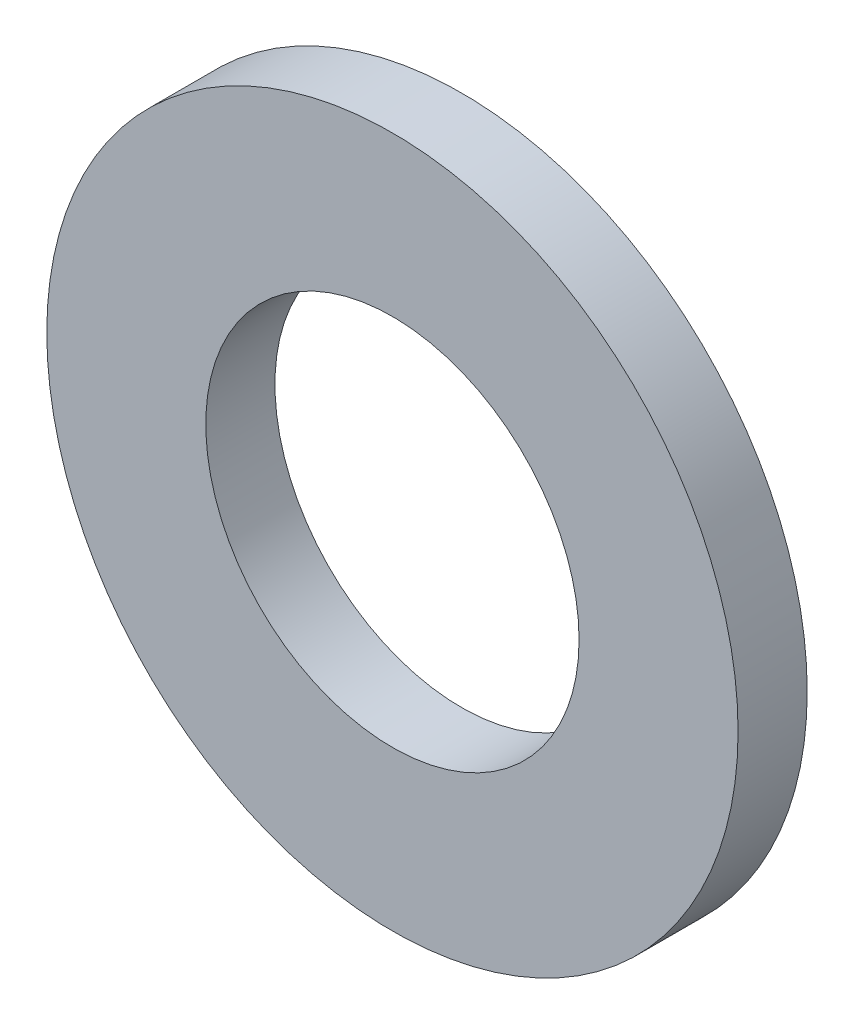
ISO-10303-21;
HEADER;
FILE_DESCRIPTION(('STEP AP214'),'2;1');
FILE_NAME('part.step','',(''),(''),'','','');
FILE_SCHEMA(('AUTOMOTIVE_DESIGN { 1 0 10303 214 1 1 1 1 }'));
ENDSEC;
DATA;
#1=APPLICATION_CONTEXT('core data for automotive mechanical design processes');
#2=APPLICATION_PROTOCOL_DEFINITION('international standard','automotive_design',2000,#1);
#3=PRODUCT_CONTEXT('',#1,'mechanical');
#4=PRODUCT('Part','Part','',(#3));
#5=PRODUCT_RELATED_PRODUCT_CATEGORY('part','',(#4));
#6=PRODUCT_DEFINITION_FORMATION('','',#4);
#7=PRODUCT_DEFINITION_CONTEXT('part definition',#1,'design');
#8=PRODUCT_DEFINITION('design','',#6,#7);
#9=PRODUCT_DEFINITION_SHAPE('','',#8);
#10=(LENGTH_UNIT() NAMED_UNIT(*) SI_UNIT(.MILLI.,.METRE.));
#11=(NAMED_UNIT(*) PLANE_ANGLE_UNIT() SI_UNIT($,.RADIAN.));
#12=(NAMED_UNIT(*) SI_UNIT($,.STERADIAN.) SOLID_ANGLE_UNIT());
#13=UNCERTAINTY_MEASURE_WITH_UNIT(LENGTH_MEASURE(1.E-05),#10,'distance_accuracy_value','');
#14=(GEOMETRIC_REPRESENTATION_CONTEXT(3) GLOBAL_UNCERTAINTY_ASSIGNED_CONTEXT((#13)) GLOBAL_UNIT_ASSIGNED_CONTEXT((#10,
#11,#12)) REPRESENTATION_CONTEXT('',''));
#15=CARTESIAN_POINT('',(0.,0.,0.));
#16=DIRECTION('',(0.,0.,1.));
#17=DIRECTION('',(1.,0.,0.));
#18=AXIS2_PLACEMENT_3D('',#15,#16,#17);
#19=CARTESIAN_POINT('',(0.,0.,0.));
#20=DIRECTION('',(0.,0.,1.));
#21=DIRECTION('',(1.,0.,0.));
#22=AXIS2_PLACEMENT_3D('',#19,#20,#21);
#23=PLANE('',#22);
#24=CARTESIAN_POINT('',(0.,0.,0.));
#25=DIRECTION('',(0.,0.,1.));
#26=DIRECTION('',(1.,0.,0.));
#27=AXIS2_PLACEMENT_3D('',#24,#25,#26);
#28=CIRCLE('',#27,2.5);
#29=CARTESIAN_POINT('',(2.5,0.,0.));
#30=VERTEX_POINT('',#29);
#31=EDGE_CURVE('E26',#30,#30,#28,.F.);
#32=ORIENTED_EDGE('',*,*,#31,.F.);
#33=EDGE_LOOP('',(#32));
#34=FACE_BOUND('',#33,.T.);
#35=CARTESIAN_POINT('',(0.,0.,0.));
#36=DIRECTION('',(0.,0.,1.));
#37=DIRECTION('',(1.,0.,0.));
#38=AXIS2_PLACEMENT_3D('',#35,#36,#37);
#39=CIRCLE('',#38,1.35);
#40=CARTESIAN_POINT('',(1.35,0.,0.));
#41=VERTEX_POINT('',#40);
#42=EDGE_CURVE('E17',#41,#41,#39,.F.);
#43=ORIENTED_EDGE('',*,*,#42,.T.);
#44=EDGE_LOOP('',(#43));
#45=FACE_BOUND('',#44,.T.);
#46=ADVANCED_FACE('F14',(#34,#45),#23,.T.);
#47=CARTESIAN_POINT('',(0.,0.,-0.5));
#48=DIRECTION('',(0.,0.,1.));
#49=DIRECTION('',(1.,0.,0.));
#50=AXIS2_PLACEMENT_3D('',#47,#48,#49);
#51=CYLINDRICAL_SURFACE('',#50,1.35);
#52=CARTESIAN_POINT('',(0.,0.,-0.5));
#53=DIRECTION('',(0.,0.,1.));
#54=DIRECTION('',(1.,0.,0.));
#55=AXIS2_PLACEMENT_3D('',#52,#53,#54);
#56=CIRCLE('',#55,1.35);
#57=CARTESIAN_POINT('',(1.35,0.,-0.5));
#58=VERTEX_POINT('',#57);
#59=EDGE_CURVE('E21',#58,#58,#56,.F.);
#60=ORIENTED_EDGE('',*,*,#59,.T.);
#61=EDGE_LOOP('',(#60));
#62=FACE_BOUND('',#61,.T.);
#63=ORIENTED_EDGE('',*,*,#42,.F.);
#64=EDGE_LOOP('',(#63));
#65=FACE_BOUND('',#64,.T.);
#66=ADVANCED_FACE('F35',(#62,#65),#51,.F.);
#67=CARTESIAN_POINT('',(0.,0.,-0.5));
#68=DIRECTION('',(0.,0.,1.));
#69=DIRECTION('',(1.,0.,0.));
#70=AXIS2_PLACEMENT_3D('',#67,#68,#69);
#71=CYLINDRICAL_SURFACE('',#70,2.5);
#72=ORIENTED_EDGE('',*,*,#31,.T.);
#73=EDGE_LOOP('',(#72));
#74=FACE_BOUND('',#73,.T.);
#75=CARTESIAN_POINT('',(0.,0.,-0.5));
#76=DIRECTION('',(0.,0.,1.));
#77=DIRECTION('',(1.,0.,0.));
#78=AXIS2_PLACEMENT_3D('',#75,#76,#77);
#79=CIRCLE('',#78,2.5);
#80=CARTESIAN_POINT('',(2.5,0.,-0.5));
#81=VERTEX_POINT('',#80);
#82=EDGE_CURVE('E10',#81,#81,#79,.T.);
#83=ORIENTED_EDGE('',*,*,#82,.T.);
#84=EDGE_LOOP('',(#83));
#85=FACE_BOUND('',#84,.T.);
#86=ADVANCED_FACE('F37',(#74,#85),#71,.T.);
#87=CARTESIAN_POINT('',(0.,0.,-0.5));
#88=DIRECTION('',(0.,0.,1.));
#89=DIRECTION('',(1.,0.,0.));
#90=AXIS2_PLACEMENT_3D('',#87,#88,#89);
#91=PLANE('',#90);
#92=ORIENTED_EDGE('',*,*,#82,.F.);
#93=EDGE_LOOP('',(#92));
#94=FACE_BOUND('',#93,.T.);
#95=ORIENTED_EDGE('',*,*,#59,.F.);
#96=EDGE_LOOP('',(#95));
#97=FACE_BOUND('',#96,.T.);
#98=ADVANCED_FACE('F44',(#94,#97),#91,.F.);
#99=CLOSED_SHELL('',(#46,#66,#86,#98));
#100=MANIFOLD_SOLID_BREP('B1',#99);
#101=ADVANCED_BREP_SHAPE_REPRESENTATION('',(#18,#100),#14);
#102=SHAPE_DEFINITION_REPRESENTATION(#9,#101);
ENDSEC;
END-ISO-10303-21;
